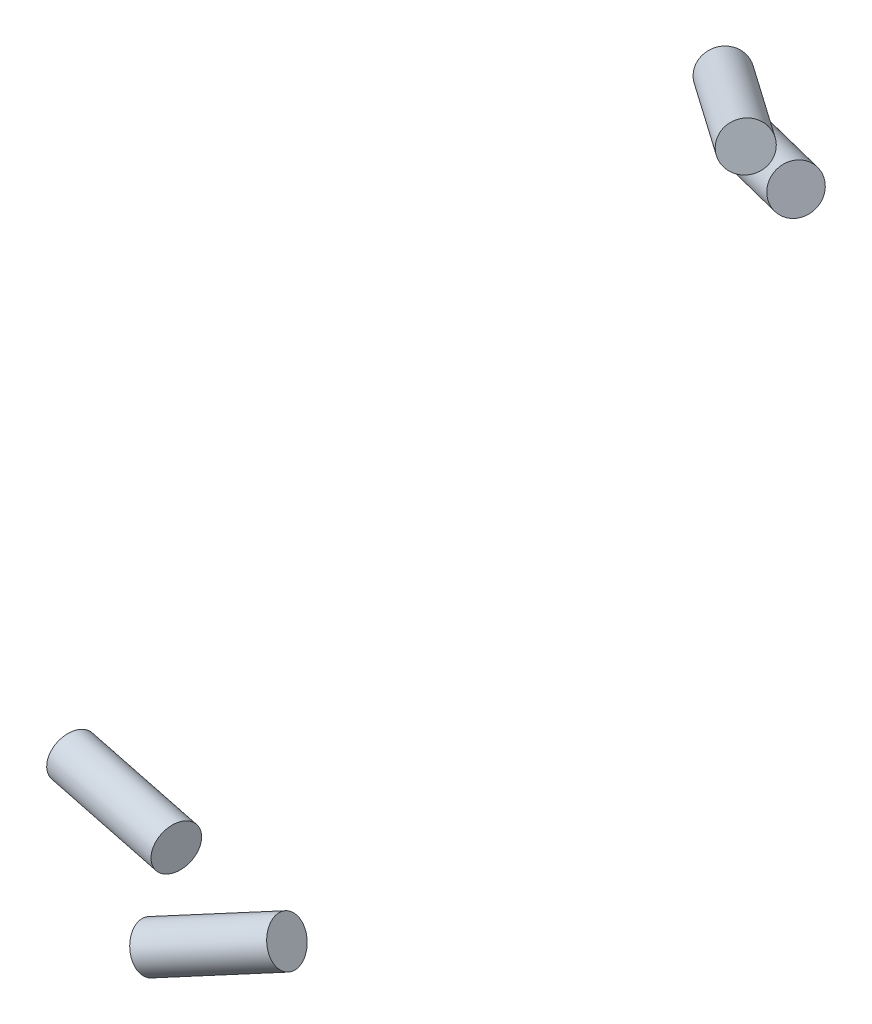
ISO-10303-21;
HEADER;
FILE_DESCRIPTION(('STEP AP214'),'2;1');
FILE_NAME('part.step','',(''),(''),'','','');
FILE_SCHEMA(('AUTOMOTIVE_DESIGN { 1 0 10303 214 1 1 1 1 }'));
ENDSEC;
DATA;
#1=APPLICATION_CONTEXT('core data for automotive mechanical design processes');
#2=APPLICATION_PROTOCOL_DEFINITION('international standard','automotive_design',2000,#1);
#3=PRODUCT_CONTEXT('',#1,'mechanical');
#4=PRODUCT('Part','Part','',(#3));
#5=PRODUCT_RELATED_PRODUCT_CATEGORY('part','',(#4));
#6=PRODUCT_DEFINITION_FORMATION('','',#4);
#7=PRODUCT_DEFINITION_CONTEXT('part definition',#1,'design');
#8=PRODUCT_DEFINITION('design','',#6,#7);
#9=PRODUCT_DEFINITION_SHAPE('','',#8);
#10=(LENGTH_UNIT() NAMED_UNIT(*) SI_UNIT(.MILLI.,.METRE.));
#11=(NAMED_UNIT(*) PLANE_ANGLE_UNIT() SI_UNIT($,.RADIAN.));
#12=(NAMED_UNIT(*) SI_UNIT($,.STERADIAN.) SOLID_ANGLE_UNIT());
#13=UNCERTAINTY_MEASURE_WITH_UNIT(LENGTH_MEASURE(1.E-05),#10,'distance_accuracy_value','');
#14=(GEOMETRIC_REPRESENTATION_CONTEXT(3) GLOBAL_UNCERTAINTY_ASSIGNED_CONTEXT((#13)) GLOBAL_UNIT_ASSIGNED_CONTEXT((#10,
#11,#12)) REPRESENTATION_CONTEXT('',''));
#15=CARTESIAN_POINT('',(0.,0.,0.));
#16=DIRECTION('',(0.,0.,1.));
#17=DIRECTION('',(1.,0.,0.));
#18=AXIS2_PLACEMENT_3D('',#15,#16,#17);
#19=CARTESIAN_POINT('',(243.984676,1245.82104,-259.67307));
#20=DIRECTION('',(0.860563559718491,0.279073146393456,0.426085130750529));
#21=DIRECTION('',(0.443713954055414,0.,-0.896168470197713));
#22=AXIS2_PLACEMENT_3D('',#19,#20,#21);
#23=PLANE('',#22);
#24=CARTESIAN_POINT('',(243.984676,1245.82104,-259.67307));
#25=DIRECTION('',(0.860563559718491,0.279073146393456,0.426085130750529));
#26=DIRECTION('',(0.443713954055414,0.,-0.896168470197713));
#27=AXIS2_PLACEMENT_3D('',#24,#25,#26);
#28=CIRCLE('',#27,6.99999999999999);
#29=CARTESIAN_POINT('',(247.090673678388,1245.82104,-265.946249291384));
#30=VERTEX_POINT('',#29);
#31=EDGE_CURVE('E80',#30,#30,#28,.T.);
#32=ORIENTED_EDGE('',*,*,#31,.F.);
#33=EDGE_LOOP('',(#32));
#34=FACE_BOUND('',#33,.T.);
#35=ADVANCED_FACE('F74',(#34),#23,.F.);
#36=CARTESIAN_POINT('',(276.582297,1256.39216,-243.533226));
#37=DIRECTION('',(0.860563559718491,0.279073146393456,0.426085130750529));
#38=DIRECTION('',(0.443713954055414,0.,-0.896168470197713));
#39=AXIS2_PLACEMENT_3D('',#36,#37,#38);
#40=PLANE('',#39);
#41=CARTESIAN_POINT('',(276.582297,1256.39216,-243.533226));
#42=DIRECTION('',(0.860563559718491,0.279073146393456,0.426085130750529));
#43=DIRECTION('',(0.443713954055414,0.,-0.896168470197713));
#44=AXIS2_PLACEMENT_3D('',#41,#42,#43);
#45=CIRCLE('',#44,6.99999999999999);
#46=CARTESIAN_POINT('',(279.688294678388,1256.39216,-249.806405291384));
#47=VERTEX_POINT('',#46);
#48=EDGE_CURVE('E12',#47,#47,#45,.T.);
#49=ORIENTED_EDGE('',*,*,#48,.T.);
#50=EDGE_LOOP('',(#49));
#51=FACE_BOUND('',#50,.T.);
#52=ADVANCED_FACE('F89',(#51),#40,.T.);
#53=CARTESIAN_POINT('',(243.984676,1245.82104,-259.67307));
#54=DIRECTION('',(0.860563559718492,0.279073146393456,0.426085130750528));
#55=DIRECTION('',(0.443713954055413,0.,-0.896168470197714));
#56=AXIS2_PLACEMENT_3D('',#53,#54,#55);
#57=CYLINDRICAL_SURFACE('',#56,6.99999999999999);
#58=ORIENTED_EDGE('',*,*,#48,.F.);
#59=EDGE_LOOP('',(#58));
#60=FACE_BOUND('',#59,.T.);
#61=ORIENTED_EDGE('',*,*,#31,.T.);
#62=EDGE_LOOP('',(#61));
#63=FACE_BOUND('',#62,.T.);
#64=ADVANCED_FACE('F86',(#60,#63),#57,.T.);
#65=CLOSED_SHELL('',(#35,#52,#64));
#66=MANIFOLD_SOLID_BREP('B2',#65);
#67=CARTESIAN_POINT('',(238.279774,1261.68448,-258.540964));
#68=DIRECTION('',(0.763334513607169,0.231473561017193,0.603108954407184));
#69=DIRECTION('',(0.619945945495735,0.,-0.784644521209063));
#70=AXIS2_PLACEMENT_3D('',#67,#68,#69);
#71=PLANE('',#70);
#72=CARTESIAN_POINT('',(238.279774,1261.68448,-258.540964));
#73=DIRECTION('',(0.763334513607169,0.231473561017193,0.603108954407184));
#74=DIRECTION('',(0.619945945495735,0.,-0.784644521209063));
#75=AXIS2_PLACEMENT_3D('',#72,#73,#74);
#76=CIRCLE('',#75,6.99999999999999);
#77=CARTESIAN_POINT('',(242.61939561847,1261.68448,-264.033475648463));
#78=VERTEX_POINT('',#77);
#79=EDGE_CURVE('E141',#78,#78,#76,.T.);
#80=ORIENTED_EDGE('',*,*,#79,.F.);
#81=EDGE_LOOP('',(#80));
#82=FACE_BOUND('',#81,.T.);
#83=ADVANCED_FACE('F135',(#82),#71,.F.);
#84=CARTESIAN_POINT('',(272.150503,1271.95544,-231.779774));
#85=DIRECTION('',(0.763334513607169,0.231473561017193,0.603108954407184));
#86=DIRECTION('',(0.619945945495735,0.,-0.784644521209063));
#87=AXIS2_PLACEMENT_3D('',#84,#85,#86);
#88=PLANE('',#87);
#89=CARTESIAN_POINT('',(272.150503,1271.95544,-231.779774));
#90=DIRECTION('',(0.763334513607169,0.231473561017193,0.603108954407184));
#91=DIRECTION('',(0.619945945495735,0.,-0.784644521209063));
#92=AXIS2_PLACEMENT_3D('',#89,#90,#91);
#93=CIRCLE('',#92,6.99999999999999);
#94=CARTESIAN_POINT('',(276.49012461847,1271.95544,-237.272285648463));
#95=VERTEX_POINT('',#94);
#96=EDGE_CURVE('E73',#95,#95,#93,.T.);
#97=ORIENTED_EDGE('',*,*,#96,.T.);
#98=EDGE_LOOP('',(#97));
#99=FACE_BOUND('',#98,.T.);
#100=ADVANCED_FACE('F150',(#99),#88,.T.);
#101=CARTESIAN_POINT('',(238.279774,1261.68448,-258.540964));
#102=DIRECTION('',(0.763334513607168,0.231473561017203,0.603108954407181));
#103=DIRECTION('',(0.619945945495734,0.,-0.784644521209064));
#104=AXIS2_PLACEMENT_3D('',#101,#102,#103);
#105=CYLINDRICAL_SURFACE('',#104,6.99999999999999);
#106=ORIENTED_EDGE('',*,*,#96,.F.);
#107=EDGE_LOOP('',(#106));
#108=FACE_BOUND('',#107,.T.);
#109=ORIENTED_EDGE('',*,*,#79,.T.);
#110=EDGE_LOOP('',(#109));
#111=FACE_BOUND('',#110,.T.);
#112=ADVANCED_FACE('F147',(#108,#111),#105,.T.);
#113=CLOSED_SHELL('',(#83,#100,#112));
#114=MANIFOLD_SOLID_BREP('B7',#113);
#115=CARTESIAN_POINT('',(231.564969,1104.02989,-80.5982665));
#116=DIRECTION('',(0.898746633417957,0.406318121940106,-0.164803133170928));
#117=DIRECTION('',(-0.411950940921273,0.91120602624987,0.));
#118=AXIS2_PLACEMENT_3D('',#115,#116,#117);
#119=PLANE('',#118);
#120=CARTESIAN_POINT('',(231.564969,1104.02989,-80.5982665));
#121=DIRECTION('',(0.898746633417957,0.406318121940106,-0.164803133170928));
#122=DIRECTION('',(-0.411950940921273,0.91120602624987,0.));
#123=AXIS2_PLACEMENT_3D('',#120,#121,#122);
#124=CIRCLE('',#123,7.00000000000001);
#125=CARTESIAN_POINT('',(228.681312413551,1110.40833218375,-80.5982665));
#126=VERTEX_POINT('',#125);
#127=EDGE_CURVE('E201',#126,#126,#124,.T.);
#128=ORIENTED_EDGE('',*,*,#127,.F.);
#129=EDGE_LOOP('',(#128));
#130=FACE_BOUND('',#129,.T.);
#131=ADVANCED_FACE('F195',(#130),#119,.F.);
#132=CARTESIAN_POINT('',(268.814973,1120.8704,-87.4287982));
#133=DIRECTION('',(0.898746633417957,0.406318121940106,-0.164803133170928));
#134=DIRECTION('',(-0.411950940921273,0.91120602624987,0.));
#135=AXIS2_PLACEMENT_3D('',#132,#133,#134);
#136=PLANE('',#135);
#137=CARTESIAN_POINT('',(268.814973,1120.8704,-87.4287982));
#138=DIRECTION('',(0.898746633417957,0.406318121940106,-0.164803133170928));
#139=DIRECTION('',(-0.411950940921273,0.91120602624987,0.));
#140=AXIS2_PLACEMENT_3D('',#137,#138,#139);
#141=CIRCLE('',#140,7.00000000000001);
#142=CARTESIAN_POINT('',(265.931316413551,1127.24884218375,-87.4287982));
#143=VERTEX_POINT('',#142);
#144=EDGE_CURVE('E134',#143,#143,#141,.T.);
#145=ORIENTED_EDGE('',*,*,#144,.T.);
#146=EDGE_LOOP('',(#145));
#147=FACE_BOUND('',#146,.T.);
#148=ADVANCED_FACE('F210',(#147),#136,.T.);
#149=CARTESIAN_POINT('',(231.564969,1104.02989,-80.5982665));
#150=DIRECTION('',(0.898746633417957,0.406318121940105,-0.164803133170929));
#151=DIRECTION('',(-0.411950940921273,0.91120602624987,0.));
#152=AXIS2_PLACEMENT_3D('',#149,#150,#151);
#153=CYLINDRICAL_SURFACE('',#152,7.00000000000001);
#154=ORIENTED_EDGE('',*,*,#144,.F.);
#155=EDGE_LOOP('',(#154));
#156=FACE_BOUND('',#155,.T.);
#157=ORIENTED_EDGE('',*,*,#127,.T.);
#158=EDGE_LOOP('',(#157));
#159=FACE_BOUND('',#158,.T.);
#160=ADVANCED_FACE('F207',(#156,#159),#153,.T.);
#161=CLOSED_SHELL('',(#131,#148,#160));
#162=MANIFOLD_SOLID_BREP('B68',#161);
#163=CARTESIAN_POINT('',(217.967798,1156.31916,-69.0971305999999));
#164=DIRECTION('',(0.98323094573364,-0.0289381267705845,0.180054136777642));
#165=DIRECTION('',(0.180129574194047,0.,-0.983642890738642));
#166=AXIS2_PLACEMENT_3D('',#163,#164,#165);
#167=PLANE('',#166);
#168=CARTESIAN_POINT('',(217.967798,1156.31916,-69.0971305999999));
#169=DIRECTION('',(0.98323094573364,-0.0289381267705845,0.180054136777642));
#170=DIRECTION('',(0.180129574194047,0.,-0.983642890738642));
#171=AXIS2_PLACEMENT_3D('',#168,#169,#170);
#172=CIRCLE('',#171,6.99999999999999);
#173=CARTESIAN_POINT('',(219.228705019358,1156.31916,-75.9826308351704));
#174=VERTEX_POINT('',#173);
#175=EDGE_CURVE('E254',#174,#174,#172,.T.);
#176=ORIENTED_EDGE('',*,*,#175,.F.);
#177=EDGE_LOOP('',(#176));
#178=FACE_BOUND('',#177,.T.);
#179=ADVANCED_FACE('F248',(#178),#167,.F.);
#180=CARTESIAN_POINT('',(259.065027,1155.1096,-61.5712017999999));
#181=DIRECTION('',(0.98323094573364,-0.0289381267705845,0.180054136777642));
#182=DIRECTION('',(0.180129574194047,0.,-0.983642890738642));
#183=AXIS2_PLACEMENT_3D('',#180,#181,#182);
#184=PLANE('',#183);
#185=CARTESIAN_POINT('',(259.065027,1155.1096,-61.5712017999999));
#186=DIRECTION('',(0.98323094573364,-0.0289381267705845,0.180054136777642));
#187=DIRECTION('',(0.180129574194047,0.,-0.983642890738642));
#188=AXIS2_PLACEMENT_3D('',#185,#186,#187);
#189=CIRCLE('',#188,6.99999999999999);
#190=CARTESIAN_POINT('',(260.325934019358,1155.1096,-68.4567020351704));
#191=VERTEX_POINT('',#190);
#192=EDGE_CURVE('E194',#191,#191,#189,.T.);
#193=ORIENTED_EDGE('',*,*,#192,.T.);
#194=EDGE_LOOP('',(#193));
#195=FACE_BOUND('',#194,.T.);
#196=ADVANCED_FACE('F263',(#195),#184,.T.);
#197=CARTESIAN_POINT('',(217.967798,1156.31916,-69.0971305999999));
#198=DIRECTION('',(0.98323094573364,-0.0289381267705792,0.180054136777641));
#199=DIRECTION('',(0.180129574194046,0.,-0.983642890738642));
#200=AXIS2_PLACEMENT_3D('',#197,#198,#199);
#201=CYLINDRICAL_SURFACE('',#200,6.99999999999999);
#202=ORIENTED_EDGE('',*,*,#192,.F.);
#203=EDGE_LOOP('',(#202));
#204=FACE_BOUND('',#203,.T.);
#205=ORIENTED_EDGE('',*,*,#175,.T.);
#206=EDGE_LOOP('',(#205));
#207=FACE_BOUND('',#206,.T.);
#208=ADVANCED_FACE('F260',(#204,#207),#201,.T.);
#209=CLOSED_SHELL('',(#179,#196,#208));
#210=MANIFOLD_SOLID_BREP('B129',#209);
#211=ADVANCED_BREP_SHAPE_REPRESENTATION('',(#18,#66,#114,#162,#210),#14);
#212=SHAPE_DEFINITION_REPRESENTATION(#9,#211);
ENDSEC;
END-ISO-10303-21;
